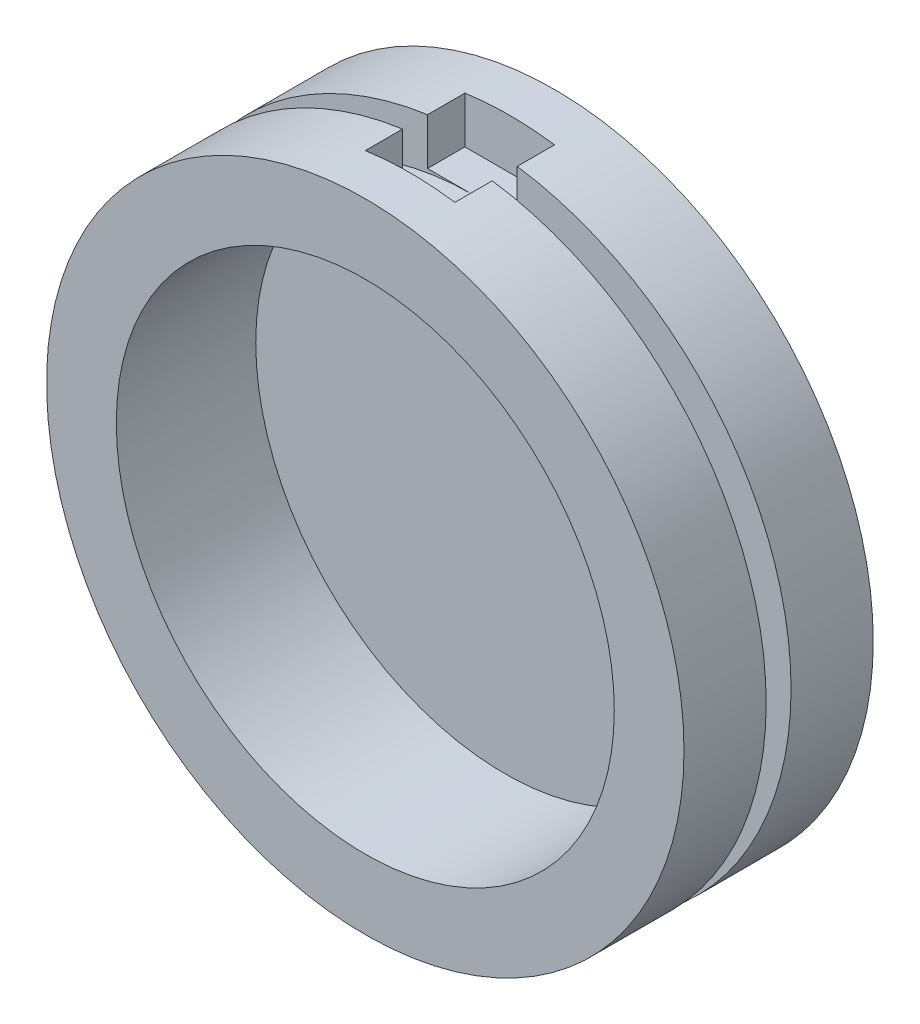
ISO-10303-21;
HEADER;
FILE_DESCRIPTION(('STEP AP214'),'2;1');
FILE_NAME('part.step','',(''),(''),'','','');
FILE_SCHEMA(('AUTOMOTIVE_DESIGN { 1 0 10303 214 1 1 1 1 }'));
ENDSEC;
DATA;
#1=APPLICATION_CONTEXT('core data for automotive mechanical design processes');
#2=APPLICATION_PROTOCOL_DEFINITION('international standard','automotive_design',2000,#1);
#3=PRODUCT_CONTEXT('',#1,'mechanical');
#4=PRODUCT('Part','Part','',(#3));
#5=PRODUCT_RELATED_PRODUCT_CATEGORY('part','',(#4));
#6=PRODUCT_DEFINITION_FORMATION('','',#4);
#7=PRODUCT_DEFINITION_CONTEXT('part definition',#1,'design');
#8=PRODUCT_DEFINITION('design','',#6,#7);
#9=PRODUCT_DEFINITION_SHAPE('','',#8);
#10=(LENGTH_UNIT() NAMED_UNIT(*) SI_UNIT(.MILLI.,.METRE.));
#11=(NAMED_UNIT(*) PLANE_ANGLE_UNIT() SI_UNIT($,.RADIAN.));
#12=(NAMED_UNIT(*) SI_UNIT($,.STERADIAN.) SOLID_ANGLE_UNIT());
#13=UNCERTAINTY_MEASURE_WITH_UNIT(LENGTH_MEASURE(1.E-05),#10,'distance_accuracy_value','');
#14=(GEOMETRIC_REPRESENTATION_CONTEXT(3) GLOBAL_UNCERTAINTY_ASSIGNED_CONTEXT((#13)) GLOBAL_UNIT_ASSIGNED_CONTEXT((#10,
#11,#12)) REPRESENTATION_CONTEXT('',''));
#15=CARTESIAN_POINT('',(0.,0.,0.));
#16=DIRECTION('',(0.,0.,1.));
#17=DIRECTION('',(1.,0.,0.));
#18=AXIS2_PLACEMENT_3D('',#15,#16,#17);
#19=CARTESIAN_POINT('',(0.,0.,5.));
#20=DIRECTION('',(0.,0.,1.));
#21=DIRECTION('',(1.,0.,0.));
#22=AXIS2_PLACEMENT_3D('',#19,#20,#21);
#23=CYLINDRICAL_SURFACE('',#22,32.);
#24=CARTESIAN_POINT('',(0.,0.,0.));
#25=DIRECTION('',(0.,0.,1.));
#26=DIRECTION('',(1.,0.,0.));
#27=AXIS2_PLACEMENT_3D('',#24,#25,#26);
#28=CIRCLE('',#27,32.);
#29=CARTESIAN_POINT('',(32.,0.,0.));
#30=VERTEX_POINT('',#29);
#31=EDGE_CURVE('E283',#30,#30,#28,.T.);
#32=ORIENTED_EDGE('',*,*,#31,.T.);
#33=EDGE_LOOP('',(#32));
#34=FACE_BOUND('',#33,.T.);
#35=DIRECTION('',(0.,0.,1.));
#36=VECTOR('',#35,1.);
#37=CARTESIAN_POINT('',(-4.5,-31.6820138248818,5.));
#38=LINE('',#37,#36);
#39=CARTESIAN_POINT('',(-4.5,-31.6820138248818,8.25));
#40=VERTEX_POINT('',#39);
#41=CARTESIAN_POINT('',(-4.5,-31.6820138248818,4.5));
#42=VERTEX_POINT('',#41);
#43=EDGE_CURVE('E180',#40,#42,#38,.F.);
#44=ORIENTED_EDGE('',*,*,#43,.F.);
#45=CARTESIAN_POINT('',(0.,0.,8.25));
#46=DIRECTION('',(0.,0.,1.));
#47=DIRECTION('',(1.,0.,0.));
#48=AXIS2_PLACEMENT_3D('',#45,#46,#47);
#49=CIRCLE('',#48,32.);
#50=CARTESIAN_POINT('',(-4.5,31.6820138248818,8.25));
#51=VERTEX_POINT('',#50);
#52=EDGE_CURVE('E280',#51,#40,#49,.T.);
#53=ORIENTED_EDGE('',*,*,#52,.F.);
#54=DIRECTION('',(0.,0.,1.));
#55=VECTOR('',#54,1.);
#56=CARTESIAN_POINT('',(-4.5,31.6820138248818,5.));
#57=LINE('',#56,#55);
#58=CARTESIAN_POINT('',(-4.5,31.6820138248818,4.5));
#59=VERTEX_POINT('',#58);
#60=EDGE_CURVE('E251',#51,#59,#57,.F.);
#61=ORIENTED_EDGE('',*,*,#60,.T.);
#62=CARTESIAN_POINT('',(0.,0.,4.5));
#63=DIRECTION('',(0.,0.,-1.));
#64=DIRECTION('',(-1.,0.,0.));
#65=AXIS2_PLACEMENT_3D('',#62,#63,#64);
#66=CIRCLE('',#65,32.);
#67=CARTESIAN_POINT('',(4.5,31.6820138248818,4.5));
#68=VERTEX_POINT('',#67);
#69=EDGE_CURVE('E299',#59,#68,#66,.T.);
#70=ORIENTED_EDGE('',*,*,#69,.T.);
#71=DIRECTION('',(0.,0.,1.));
#72=VECTOR('',#71,1.);
#73=CARTESIAN_POINT('',(4.5,31.6820138248818,5.));
#74=LINE('',#73,#72);
#75=CARTESIAN_POINT('',(4.5,31.6820138248818,8.25));
#76=VERTEX_POINT('',#75);
#77=EDGE_CURVE('E242',#68,#76,#74,.T.);
#78=ORIENTED_EDGE('',*,*,#77,.T.);
#79=CARTESIAN_POINT('',(4.5,-31.6820138248818,8.25));
#80=VERTEX_POINT('',#79);
#81=EDGE_CURVE('E279',#80,#76,#49,.T.);
#82=ORIENTED_EDGE('',*,*,#81,.F.);
#83=DIRECTION('',(0.,0.,1.));
#84=VECTOR('',#83,1.);
#85=CARTESIAN_POINT('',(4.5,-31.6820138248818,5.));
#86=LINE('',#85,#84);
#87=CARTESIAN_POINT('',(4.5,-31.6820138248818,4.5));
#88=VERTEX_POINT('',#87);
#89=EDGE_CURVE('E202',#88,#80,#86,.T.);
#90=ORIENTED_EDGE('',*,*,#89,.F.);
#91=CARTESIAN_POINT('',(0.,0.,4.5));
#92=DIRECTION('',(0.,0.,1.));
#93=DIRECTION('',(1.,0.,0.));
#94=AXIS2_PLACEMENT_3D('',#91,#92,#93);
#95=CIRCLE('',#94,32.);
#96=EDGE_CURVE('E11',#42,#88,#95,.T.);
#97=ORIENTED_EDGE('',*,*,#96,.F.);
#98=EDGE_LOOP('',(#44,#53,#61,#70,#78,#82,#90,#97));
#99=FACE_BOUND('',#98,.T.);
#100=ADVANCED_FACE('F39',(#34,#99),#23,.T.);
#101=CARTESIAN_POINT('',(0.,32.,8.25));
#102=DIRECTION('',(0.,0.,-1.));
#103=DIRECTION('',(-1.,0.,0.));
#104=AXIS2_PLACEMENT_3D('',#101,#102,#103);
#105=PLANE('',#104);
#106=DIRECTION('',(0.,-1.,0.));
#107=VECTOR('',#106,1.);
#108=CARTESIAN_POINT('',(-4.5,32.,8.25));
#109=LINE('',#108,#107);
#110=CARTESIAN_POINT('',(-4.5,-27.,8.25));
#111=VERTEX_POINT('',#110);
#112=EDGE_CURVE('E206',#111,#40,#109,.T.);
#113=ORIENTED_EDGE('',*,*,#112,.F.);
#114=DIRECTION('',(1.,0.,0.));
#115=VECTOR('',#114,1.);
#116=CARTESIAN_POINT('',(0.,-27.,8.25));
#117=LINE('',#116,#115);
#118=CARTESIAN_POINT('',(0.,-27.,8.25));
#119=VERTEX_POINT('',#118);
#120=EDGE_CURVE('E185',#111,#119,#117,.T.);
#121=ORIENTED_EDGE('',*,*,#120,.T.);
#122=CARTESIAN_POINT('',(0.,0.,8.25));
#123=DIRECTION('',(0.,0.,1.));
#124=DIRECTION('',(1.,0.,0.));
#125=AXIS2_PLACEMENT_3D('',#122,#123,#124);
#126=CIRCLE('',#125,27.);
#127=CARTESIAN_POINT('',(0.,27.,8.25));
#128=VERTEX_POINT('',#127);
#129=EDGE_CURVE('E276',#128,#119,#126,.T.);
#130=ORIENTED_EDGE('',*,*,#129,.F.);
#131=DIRECTION('',(-1.,0.,0.));
#132=VECTOR('',#131,1.);
#133=CARTESIAN_POINT('',(0.,27.,8.25));
#134=LINE('',#133,#132);
#135=CARTESIAN_POINT('',(-4.5,27.,8.25));
#136=VERTEX_POINT('',#135);
#137=EDGE_CURVE('E254',#128,#136,#134,.T.);
#138=ORIENTED_EDGE('',*,*,#137,.T.);
#139=DIRECTION('',(0.,1.,0.));
#140=VECTOR('',#139,1.);
#141=CARTESIAN_POINT('',(-4.5,32.,8.25));
#142=LINE('',#141,#140);
#143=EDGE_CURVE('E248',#136,#51,#142,.T.);
#144=ORIENTED_EDGE('',*,*,#143,.T.);
#145=ORIENTED_EDGE('',*,*,#52,.T.);
#146=EDGE_LOOP('',(#113,#121,#130,#138,#144,#145));
#147=FACE_BOUND('',#146,.T.);
#148=ADVANCED_FACE('F337',(#147),#105,.F.);
#149=DIRECTION('',(0.,1.,0.));
#150=VECTOR('',#149,1.);
#151=CARTESIAN_POINT('',(4.5,32.,8.25));
#152=LINE('',#151,#150);
#153=CARTESIAN_POINT('',(4.5,-27.,8.25));
#154=VERTEX_POINT('',#153);
#155=EDGE_CURVE('E200',#80,#154,#152,.T.);
#156=ORIENTED_EDGE('',*,*,#155,.F.);
#157=ORIENTED_EDGE('',*,*,#81,.T.);
#158=DIRECTION('',(0.,-1.,0.));
#159=VECTOR('',#158,1.);
#160=CARTESIAN_POINT('',(4.5,32.,8.25));
#161=LINE('',#160,#159);
#162=CARTESIAN_POINT('',(4.5,27.,8.25));
#163=VERTEX_POINT('',#162);
#164=EDGE_CURVE('E239',#76,#163,#161,.T.);
#165=ORIENTED_EDGE('',*,*,#164,.T.);
#166=EDGE_CURVE('E257',#163,#128,#134,.T.);
#167=ORIENTED_EDGE('',*,*,#166,.T.);
#168=EDGE_CURVE('E275',#119,#128,#126,.T.);
#169=ORIENTED_EDGE('',*,*,#168,.F.);
#170=EDGE_CURVE('E209',#119,#154,#117,.T.);
#171=ORIENTED_EDGE('',*,*,#170,.T.);
#172=EDGE_LOOP('',(#156,#157,#165,#167,#169,#171));
#173=FACE_BOUND('',#172,.T.);
#174=ADVANCED_FACE('F341',(#173),#105,.F.);
#175=CARTESIAN_POINT('',(0.,27.,10.75));
#176=DIRECTION('',(0.,0.,1.));
#177=DIRECTION('',(1.,0.,0.));
#178=AXIS2_PLACEMENT_3D('',#175,#176,#177);
#179=PLANE('',#178);
#180=DIRECTION('',(0.,1.,0.));
#181=VECTOR('',#180,1.);
#182=CARTESIAN_POINT('',(-4.5,27.,10.75));
#183=LINE('',#182,#181);
#184=CARTESIAN_POINT('',(-4.5,-31.6820138248818,10.75));
#185=VERTEX_POINT('',#184);
#186=CARTESIAN_POINT('',(-4.5,-27.,10.75));
#187=VERTEX_POINT('',#186);
#188=EDGE_CURVE('E204',#185,#187,#183,.T.);
#189=ORIENTED_EDGE('',*,*,#188,.F.);
#190=CARTESIAN_POINT('',(0.,0.,10.75));
#191=DIRECTION('',(0.,0.,1.));
#192=DIRECTION('',(1.,0.,0.));
#193=AXIS2_PLACEMENT_3D('',#190,#191,#192);
#194=CIRCLE('',#193,32.);
#195=CARTESIAN_POINT('',(-4.5,31.6820138248818,10.75));
#196=VERTEX_POINT('',#195);
#197=EDGE_CURVE('E268',#196,#185,#194,.T.);
#198=ORIENTED_EDGE('',*,*,#197,.F.);
#199=DIRECTION('',(0.,-1.,0.));
#200=VECTOR('',#199,1.);
#201=CARTESIAN_POINT('',(-4.5,27.,10.75));
#202=LINE('',#201,#200);
#203=CARTESIAN_POINT('',(-4.5,27.,10.75));
#204=VERTEX_POINT('',#203);
#205=EDGE_CURVE('E245',#196,#204,#202,.T.);
#206=ORIENTED_EDGE('',*,*,#205,.T.);
#207=DIRECTION('',(1.,0.,0.));
#208=VECTOR('',#207,1.);
#209=CARTESIAN_POINT('',(0.,27.,10.75));
#210=LINE('',#209,#208);
#211=CARTESIAN_POINT('',(0.,27.,10.75));
#212=VERTEX_POINT('',#211);
#213=EDGE_CURVE('E298',#204,#212,#210,.T.);
#214=ORIENTED_EDGE('',*,*,#213,.T.);
#215=CARTESIAN_POINT('',(0.,0.,10.75));
#216=DIRECTION('',(0.,0.,1.));
#217=DIRECTION('',(1.,0.,0.));
#218=AXIS2_PLACEMENT_3D('',#215,#216,#217);
#219=CIRCLE('',#218,27.);
#220=CARTESIAN_POINT('',(0.,-27.,10.75));
#221=VERTEX_POINT('',#220);
#222=EDGE_CURVE('E272',#212,#221,#219,.T.);
#223=ORIENTED_EDGE('',*,*,#222,.T.);
#224=DIRECTION('',(-1.,0.,0.));
#225=VECTOR('',#224,1.);
#226=CARTESIAN_POINT('',(0.,-27.,10.75));
#227=LINE('',#226,#225);
#228=EDGE_CURVE('E307',#221,#187,#227,.T.);
#229=ORIENTED_EDGE('',*,*,#228,.T.);
#230=EDGE_LOOP('',(#189,#198,#206,#214,#223,#229));
#231=FACE_BOUND('',#230,.T.);
#232=ADVANCED_FACE('F324',(#231),#179,.F.);
#233=DIRECTION('',(0.,-1.,0.));
#234=VECTOR('',#233,1.);
#235=CARTESIAN_POINT('',(4.5,27.,10.75));
#236=LINE('',#235,#234);
#237=CARTESIAN_POINT('',(4.5,-27.,10.75));
#238=VERTEX_POINT('',#237);
#239=CARTESIAN_POINT('',(4.5,-31.6820138248818,10.75));
#240=VERTEX_POINT('',#239);
#241=EDGE_CURVE('E62',#238,#240,#236,.T.);
#242=ORIENTED_EDGE('',*,*,#241,.F.);
#243=EDGE_CURVE('E47',#238,#221,#227,.T.);
#244=ORIENTED_EDGE('',*,*,#243,.T.);
#245=EDGE_CURVE('E271',#221,#212,#219,.T.);
#246=ORIENTED_EDGE('',*,*,#245,.T.);
#247=CARTESIAN_POINT('',(4.5,27.,10.75));
#248=VERTEX_POINT('',#247);
#249=EDGE_CURVE('E295',#212,#248,#210,.T.);
#250=ORIENTED_EDGE('',*,*,#249,.T.);
#251=DIRECTION('',(0.,1.,0.));
#252=VECTOR('',#251,1.);
#253=CARTESIAN_POINT('',(4.5,27.,10.75));
#254=LINE('',#253,#252);
#255=CARTESIAN_POINT('',(4.5,31.6820138248818,10.75));
#256=VERTEX_POINT('',#255);
#257=EDGE_CURVE('E229',#248,#256,#254,.T.);
#258=ORIENTED_EDGE('',*,*,#257,.T.);
#259=EDGE_CURVE('E267',#240,#256,#194,.T.);
#260=ORIENTED_EDGE('',*,*,#259,.F.);
#261=EDGE_LOOP('',(#242,#244,#246,#250,#258,#260));
#262=FACE_BOUND('',#261,.T.);
#263=ADVANCED_FACE('F314',(#262),#179,.F.);
#264=CARTESIAN_POINT('',(0.,0.,5.));
#265=DIRECTION('',(0.,0.,1.));
#266=DIRECTION('',(1.,0.,0.));
#267=AXIS2_PLACEMENT_3D('',#264,#265,#266);
#268=CYLINDRICAL_SURFACE('',#267,32.);
#269=CARTESIAN_POINT('',(0.,0.,19.));
#270=DIRECTION('',(0.,0.,1.));
#271=DIRECTION('',(1.,0.,0.));
#272=AXIS2_PLACEMENT_3D('',#269,#270,#271);
#273=CIRCLE('',#272,32.);
#274=CARTESIAN_POINT('',(32.,0.,19.));
#275=VERTEX_POINT('',#274);
#276=EDGE_CURVE('E264',#275,#275,#273,.T.);
#277=ORIENTED_EDGE('',*,*,#276,.F.);
#278=EDGE_LOOP('',(#277));
#279=FACE_BOUND('',#278,.T.);
#280=CARTESIAN_POINT('',(0.,0.,14.5));
#281=DIRECTION('',(0.,0.,-1.));
#282=DIRECTION('',(-1.,0.,0.));
#283=AXIS2_PLACEMENT_3D('',#280,#281,#282);
#284=CIRCLE('',#283,32.);
#285=CARTESIAN_POINT('',(4.5,-31.6820138248818,14.5));
#286=VERTEX_POINT('',#285);
#287=CARTESIAN_POINT('',(-4.5,-31.6820138248818,14.5));
#288=VERTEX_POINT('',#287);
#289=EDGE_CURVE('E302',#286,#288,#284,.T.);
#290=ORIENTED_EDGE('',*,*,#289,.F.);
#291=DIRECTION('',(0.,0.,1.));
#292=VECTOR('',#291,1.);
#293=CARTESIAN_POINT('',(4.5,-31.6820138248818,5.));
#294=LINE('',#293,#292);
#295=EDGE_CURVE('E306',#240,#286,#294,.T.);
#296=ORIENTED_EDGE('',*,*,#295,.F.);
#297=ORIENTED_EDGE('',*,*,#259,.T.);
#298=DIRECTION('',(0.,0.,1.));
#299=VECTOR('',#298,1.);
#300=CARTESIAN_POINT('',(4.5,31.6820138248818,5.));
#301=LINE('',#300,#299);
#302=CARTESIAN_POINT('',(4.5,31.6820138248818,14.5));
#303=VERTEX_POINT('',#302);
#304=EDGE_CURVE('E292',#256,#303,#301,.T.);
#305=ORIENTED_EDGE('',*,*,#304,.T.);
#306=CARTESIAN_POINT('',(0.,0.,14.5));
#307=DIRECTION('',(0.,0.,1.));
#308=DIRECTION('',(1.,0.,0.));
#309=AXIS2_PLACEMENT_3D('',#306,#307,#308);
#310=CIRCLE('',#309,32.);
#311=CARTESIAN_POINT('',(-4.5,31.6820138248818,14.5));
#312=VERTEX_POINT('',#311);
#313=EDGE_CURVE('E286',#303,#312,#310,.T.);
#314=ORIENTED_EDGE('',*,*,#313,.T.);
#315=DIRECTION('',(0.,0.,1.));
#316=VECTOR('',#315,1.);
#317=CARTESIAN_POINT('',(-4.5,31.6820138248818,5.));
#318=LINE('',#317,#316);
#319=EDGE_CURVE('E289',#312,#196,#318,.F.);
#320=ORIENTED_EDGE('',*,*,#319,.T.);
#321=ORIENTED_EDGE('',*,*,#197,.T.);
#322=DIRECTION('',(0.,0.,1.));
#323=VECTOR('',#322,1.);
#324=CARTESIAN_POINT('',(-4.5,-31.6820138248818,5.));
#325=LINE('',#324,#323);
#326=EDGE_CURVE('E304',#288,#185,#325,.F.);
#327=ORIENTED_EDGE('',*,*,#326,.F.);
#328=EDGE_LOOP('',(#290,#296,#297,#305,#314,#320,#321,#327));
#329=FACE_BOUND('',#328,.T.);
#330=ADVANCED_FACE('F355',(#279,#329),#268,.T.);
#331=CARTESIAN_POINT('',(0.,0.,0.));
#332=DIRECTION('',(0.,0.,1.));
#333=DIRECTION('',(1.,0.,0.));
#334=AXIS2_PLACEMENT_3D('',#331,#332,#333);
#335=PLANE('',#334);
#336=ORIENTED_EDGE('',*,*,#31,.F.);
#337=EDGE_LOOP('',(#336));
#338=FACE_BOUND('',#337,.T.);
#339=ADVANCED_FACE('F41',(#338),#335,.F.);
#340=CARTESIAN_POINT('',(0.,0.,5.));
#341=DIRECTION('',(0.,0.,1.));
#342=DIRECTION('',(1.,0.,0.));
#343=AXIS2_PLACEMENT_3D('',#340,#341,#342);
#344=CYLINDRICAL_SURFACE('',#343,27.);
#345=ORIENTED_EDGE('',*,*,#245,.F.);
#346=ORIENTED_EDGE('',*,*,#222,.F.);
#347=EDGE_LOOP('',(#345,#346));
#348=FACE_BOUND('',#347,.T.);
#349=ORIENTED_EDGE('',*,*,#129,.T.);
#350=ORIENTED_EDGE('',*,*,#168,.T.);
#351=EDGE_LOOP('',(#349,#350));
#352=FACE_BOUND('',#351,.T.);
#353=ADVANCED_FACE('F321',(#348,#352),#344,.T.);
#354=CARTESIAN_POINT('',(0.,32.,19.));
#355=DIRECTION('',(0.,0.,-1.));
#356=DIRECTION('',(-1.,0.,0.));
#357=AXIS2_PLACEMENT_3D('',#354,#355,#356);
#358=PLANE('',#357);
#359=CARTESIAN_POINT('',(0.,0.,19.));
#360=DIRECTION('',(0.,0.,1.));
#361=DIRECTION('',(1.,0.,0.));
#362=AXIS2_PLACEMENT_3D('',#359,#360,#361);
#363=CIRCLE('',#362,25.);
#364=CARTESIAN_POINT('',(25.,0.,19.));
#365=VERTEX_POINT('',#364);
#366=EDGE_CURVE('E261',#365,#365,#363,.T.);
#367=ORIENTED_EDGE('',*,*,#366,.F.);
#368=EDGE_LOOP('',(#367));
#369=FACE_BOUND('',#368,.T.);
#370=ORIENTED_EDGE('',*,*,#276,.T.);
#371=EDGE_LOOP('',(#370));
#372=FACE_BOUND('',#371,.T.);
#373=ADVANCED_FACE('F344',(#369,#372),#358,.F.);
#374=CARTESIAN_POINT('',(0.,0.,5.));
#375=DIRECTION('',(0.,0.,1.));
#376=DIRECTION('',(1.,0.,0.));
#377=AXIS2_PLACEMENT_3D('',#374,#375,#376);
#378=CYLINDRICAL_SURFACE('',#377,25.);
#379=CARTESIAN_POINT('',(0.,0.,5.));
#380=DIRECTION('',(0.,0.,1.));
#381=DIRECTION('',(1.,0.,0.));
#382=AXIS2_PLACEMENT_3D('',#379,#380,#381);
#383=CIRCLE('',#382,25.);
#384=CARTESIAN_POINT('',(25.,0.,5.));
#385=VERTEX_POINT('',#384);
#386=EDGE_CURVE('E258',#385,#385,#383,.T.);
#387=ORIENTED_EDGE('',*,*,#386,.F.);
#388=EDGE_LOOP('',(#387));
#389=FACE_BOUND('',#388,.T.);
#390=ORIENTED_EDGE('',*,*,#366,.T.);
#391=EDGE_LOOP('',(#390));
#392=FACE_BOUND('',#391,.T.);
#393=ADVANCED_FACE('F351',(#389,#392),#378,.F.);
#394=CARTESIAN_POINT('',(0.,25.,5.));
#395=DIRECTION('',(0.,0.,-1.));
#396=DIRECTION('',(-1.,0.,0.));
#397=AXIS2_PLACEMENT_3D('',#394,#395,#396);
#398=PLANE('',#397);
#399=ORIENTED_EDGE('',*,*,#386,.T.);
#400=EDGE_LOOP('',(#399));
#401=FACE_BOUND('',#400,.T.);
#402=ADVANCED_FACE('F415',(#401),#398,.F.);
#403=CARTESIAN_POINT('',(-4.5,27.,14.5));
#404=DIRECTION('',(0.,0.,1.));
#405=DIRECTION('',(1.,0.,0.));
#406=AXIS2_PLACEMENT_3D('',#403,#404,#405);
#407=PLANE('',#406);
#408=DIRECTION('',(0.,1.,0.));
#409=VECTOR('',#408,1.);
#410=CARTESIAN_POINT('',(4.5,27.,14.5));
#411=LINE('',#410,#409);
#412=CARTESIAN_POINT('',(4.5,27.,14.5));
#413=VERTEX_POINT('',#412);
#414=EDGE_CURVE('E233',#413,#303,#411,.T.);
#415=ORIENTED_EDGE('',*,*,#414,.F.);
#416=DIRECTION('',(1.,0.,0.));
#417=VECTOR('',#416,1.);
#418=CARTESIAN_POINT('',(-4.5,27.,14.5));
#419=LINE('',#418,#417);
#420=CARTESIAN_POINT('',(-4.5,27.,14.5));
#421=VERTEX_POINT('',#420);
#422=EDGE_CURVE('E214',#421,#413,#419,.T.);
#423=ORIENTED_EDGE('',*,*,#422,.F.);
#424=DIRECTION('',(0.,1.,0.));
#425=VECTOR('',#424,1.);
#426=CARTESIAN_POINT('',(-4.5,27.,14.5));
#427=LINE('',#426,#425);
#428=EDGE_CURVE('E225',#421,#312,#427,.T.);
#429=ORIENTED_EDGE('',*,*,#428,.T.);
#430=ORIENTED_EDGE('',*,*,#313,.F.);
#431=EDGE_LOOP('',(#415,#423,#429,#430));
#432=FACE_BOUND('',#431,.T.);
#433=ADVANCED_FACE('F409',(#432),#407,.F.);
#434=CARTESIAN_POINT('',(4.5,27.,14.5));
#435=DIRECTION('',(1.,0.,0.));
#436=DIRECTION('',(0.,0.,-1.));
#437=AXIS2_PLACEMENT_3D('',#434,#435,#436);
#438=PLANE('',#437);
#439=DIRECTION('',(0.,0.,-1.));
#440=VECTOR('',#439,1.);
#441=CARTESIAN_POINT('',(4.5,27.,14.5));
#442=LINE('',#441,#440);
#443=EDGE_CURVE('E219',#413,#248,#442,.T.);
#444=ORIENTED_EDGE('',*,*,#443,.F.);
#445=ORIENTED_EDGE('',*,*,#414,.T.);
#446=ORIENTED_EDGE('',*,*,#304,.F.);
#447=ORIENTED_EDGE('',*,*,#257,.F.);
#448=EDGE_LOOP('',(#444,#445,#446,#447));
#449=FACE_BOUND('',#448,.T.);
#450=ADVANCED_FACE('F400',(#449),#438,.F.);
#451=CARTESIAN_POINT('',(-4.5,27.,14.5));
#452=DIRECTION('',(-1.,0.,0.));
#453=DIRECTION('',(0.,0.,1.));
#454=AXIS2_PLACEMENT_3D('',#451,#452,#453);
#455=PLANE('',#454);
#456=ORIENTED_EDGE('',*,*,#319,.F.);
#457=ORIENTED_EDGE('',*,*,#428,.F.);
#458=DIRECTION('',(0.,0.,1.));
#459=VECTOR('',#458,1.);
#460=CARTESIAN_POINT('',(-4.5,27.,14.5));
#461=LINE('',#460,#459);
#462=EDGE_CURVE('E215',#204,#421,#461,.T.);
#463=ORIENTED_EDGE('',*,*,#462,.F.);
#464=ORIENTED_EDGE('',*,*,#205,.F.);
#465=EDGE_LOOP('',(#456,#457,#463,#464));
#466=FACE_BOUND('',#465,.T.);
#467=ADVANCED_FACE('F332',(#466),#455,.F.);
#468=CARTESIAN_POINT('',(0.,27.,0.));
#469=DIRECTION('',(0.,-1.,0.));
#470=DIRECTION('',(0.,0.,-1.));
#471=AXIS2_PLACEMENT_3D('',#468,#469,#470);
#472=PLANE('',#471);
#473=ORIENTED_EDGE('',*,*,#462,.T.);
#474=ORIENTED_EDGE('',*,*,#422,.T.);
#475=ORIENTED_EDGE('',*,*,#443,.T.);
#476=ORIENTED_EDGE('',*,*,#249,.F.);
#477=ORIENTED_EDGE('',*,*,#213,.F.);
#478=EDGE_LOOP('',(#473,#474,#475,#476,#477));
#479=FACE_BOUND('',#478,.T.);
#480=ADVANCED_FACE('F328',(#479),#472,.F.);
#481=CARTESIAN_POINT('',(-4.5,27.,4.5));
#482=DIRECTION('',(0.,0.,-1.));
#483=DIRECTION('',(-1.,0.,0.));
#484=AXIS2_PLACEMENT_3D('',#481,#482,#483);
#485=PLANE('',#484);
#486=DIRECTION('',(0.,1.,0.));
#487=VECTOR('',#486,1.);
#488=CARTESIAN_POINT('',(-4.5,27.,4.5));
#489=LINE('',#488,#487);
#490=CARTESIAN_POINT('',(-4.5,27.,4.5));
#491=VERTEX_POINT('',#490);
#492=EDGE_CURVE('E226',#491,#59,#489,.T.);
#493=ORIENTED_EDGE('',*,*,#492,.F.);
#494=DIRECTION('',(-1.,0.,0.));
#495=VECTOR('',#494,1.);
#496=CARTESIAN_POINT('',(-4.5,27.,4.5));
#497=LINE('',#496,#495);
#498=CARTESIAN_POINT('',(4.5,27.,4.5));
#499=VERTEX_POINT('',#498);
#500=EDGE_CURVE('E222',#499,#491,#497,.T.);
#501=ORIENTED_EDGE('',*,*,#500,.F.);
#502=DIRECTION('',(0.,1.,0.));
#503=VECTOR('',#502,1.);
#504=CARTESIAN_POINT('',(4.5,27.,4.5));
#505=LINE('',#504,#503);
#506=EDGE_CURVE('E230',#499,#68,#505,.T.);
#507=ORIENTED_EDGE('',*,*,#506,.T.);
#508=ORIENTED_EDGE('',*,*,#69,.F.);
#509=EDGE_LOOP('',(#493,#501,#507,#508));
#510=FACE_BOUND('',#509,.T.);
#511=ADVANCED_FACE('F375',(#510),#485,.F.);
#512=EDGE_CURVE('E218',#163,#499,#442,.T.);
#513=ORIENTED_EDGE('',*,*,#512,.T.);
#514=ORIENTED_EDGE('',*,*,#500,.T.);
#515=EDGE_CURVE('E212',#491,#136,#461,.T.);
#516=ORIENTED_EDGE('',*,*,#515,.T.);
#517=ORIENTED_EDGE('',*,*,#137,.F.);
#518=ORIENTED_EDGE('',*,*,#166,.F.);
#519=EDGE_LOOP('',(#513,#514,#516,#517,#518));
#520=FACE_BOUND('',#519,.T.);
#521=ADVANCED_FACE('F404',(#520),#472,.F.);
#522=ORIENTED_EDGE('',*,*,#143,.F.);
#523=ORIENTED_EDGE('',*,*,#515,.F.);
#524=ORIENTED_EDGE('',*,*,#492,.T.);
#525=ORIENTED_EDGE('',*,*,#60,.F.);
#526=EDGE_LOOP('',(#522,#523,#524,#525));
#527=FACE_BOUND('',#526,.T.);
#528=ADVANCED_FACE('F372',(#527),#455,.F.);
#529=ORIENTED_EDGE('',*,*,#506,.F.);
#530=ORIENTED_EDGE('',*,*,#512,.F.);
#531=ORIENTED_EDGE('',*,*,#164,.F.);
#532=ORIENTED_EDGE('',*,*,#77,.F.);
#533=EDGE_LOOP('',(#529,#530,#531,#532));
#534=FACE_BOUND('',#533,.T.);
#535=ADVANCED_FACE('F380',(#534),#438,.F.);
#536=CARTESIAN_POINT('',(4.5,-27.,14.5));
#537=DIRECTION('',(-1.,0.,0.));
#538=DIRECTION('',(0.,0.,1.));
#539=AXIS2_PLACEMENT_3D('',#536,#537,#538);
#540=PLANE('',#539);
#541=ORIENTED_EDGE('',*,*,#241,.T.);
#542=ORIENTED_EDGE('',*,*,#295,.T.);
#543=DIRECTION('',(0.,-1.,0.));
#544=VECTOR('',#543,1.);
#545=CARTESIAN_POINT('',(4.5,-27.,14.5));
#546=LINE('',#545,#544);
#547=CARTESIAN_POINT('',(4.5,-27.,14.5));
#548=VERTEX_POINT('',#547);
#549=EDGE_CURVE('E195',#548,#286,#546,.T.);
#550=ORIENTED_EDGE('',*,*,#549,.F.);
#551=DIRECTION('',(0.,0.,-1.));
#552=VECTOR('',#551,1.);
#553=CARTESIAN_POINT('',(4.5,-27.,14.5));
#554=LINE('',#553,#552);
#555=EDGE_CURVE('E189',#548,#238,#554,.T.);
#556=ORIENTED_EDGE('',*,*,#555,.T.);
#557=EDGE_LOOP('',(#541,#542,#550,#556));
#558=FACE_BOUND('',#557,.T.);
#559=ADVANCED_FACE('F386',(#558),#540,.T.);
#560=CARTESIAN_POINT('',(-4.5,-27.,14.5));
#561=DIRECTION('',(0.,0.,-1.));
#562=DIRECTION('',(-1.,0.,0.));
#563=AXIS2_PLACEMENT_3D('',#560,#561,#562);
#564=PLANE('',#563);
#565=ORIENTED_EDGE('',*,*,#549,.T.);
#566=ORIENTED_EDGE('',*,*,#289,.T.);
#567=DIRECTION('',(0.,-1.,0.));
#568=VECTOR('',#567,1.);
#569=CARTESIAN_POINT('',(-4.5,-27.,14.5));
#570=LINE('',#569,#568);
#571=CARTESIAN_POINT('',(-4.5,-27.,14.5));
#572=VERTEX_POINT('',#571);
#573=EDGE_CURVE('E192',#572,#288,#570,.T.);
#574=ORIENTED_EDGE('',*,*,#573,.F.);
#575=DIRECTION('',(1.,0.,0.));
#576=VECTOR('',#575,1.);
#577=CARTESIAN_POINT('',(-4.5,-27.,14.5));
#578=LINE('',#577,#576);
#579=EDGE_CURVE('E181',#572,#548,#578,.T.);
#580=ORIENTED_EDGE('',*,*,#579,.T.);
#581=EDGE_LOOP('',(#565,#566,#574,#580));
#582=FACE_BOUND('',#581,.T.);
#583=ADVANCED_FACE('F394',(#582),#564,.T.);
#584=CARTESIAN_POINT('',(-4.5,-27.,14.5));
#585=DIRECTION('',(1.,0.,0.));
#586=DIRECTION('',(0.,0.,-1.));
#587=AXIS2_PLACEMENT_3D('',#584,#585,#586);
#588=PLANE('',#587);
#589=ORIENTED_EDGE('',*,*,#188,.T.);
#590=DIRECTION('',(0.,0.,1.));
#591=VECTOR('',#590,1.);
#592=CARTESIAN_POINT('',(-4.5,-27.,14.5));
#593=LINE('',#592,#591);
#594=EDGE_CURVE('E186',#187,#572,#593,.T.);
#595=ORIENTED_EDGE('',*,*,#594,.T.);
#596=ORIENTED_EDGE('',*,*,#573,.T.);
#597=ORIENTED_EDGE('',*,*,#326,.T.);
#598=EDGE_LOOP('',(#589,#595,#596,#597));
#599=FACE_BOUND('',#598,.T.);
#600=ADVANCED_FACE('F391',(#599),#588,.T.);
#601=CARTESIAN_POINT('',(0.,-27.,0.));
#602=DIRECTION('',(0.,1.,0.));
#603=DIRECTION('',(0.,0.,-1.));
#604=AXIS2_PLACEMENT_3D('',#601,#602,#603);
#605=PLANE('',#604);
#606=ORIENTED_EDGE('',*,*,#555,.F.);
#607=ORIENTED_EDGE('',*,*,#579,.F.);
#608=ORIENTED_EDGE('',*,*,#594,.F.);
#609=ORIENTED_EDGE('',*,*,#228,.F.);
#610=ORIENTED_EDGE('',*,*,#243,.F.);
#611=EDGE_LOOP('',(#606,#607,#608,#609,#610));
#612=FACE_BOUND('',#611,.T.);
#613=ADVANCED_FACE('F425',(#612),#605,.F.);
#614=CARTESIAN_POINT('',(-4.5,-27.,4.5));
#615=DIRECTION('',(0.,0.,1.));
#616=DIRECTION('',(1.,0.,0.));
#617=AXIS2_PLACEMENT_3D('',#614,#615,#616);
#618=PLANE('',#617);
#619=DIRECTION('',(0.,-1.,0.));
#620=VECTOR('',#619,1.);
#621=CARTESIAN_POINT('',(-4.5,-27.,4.5));
#622=LINE('',#621,#620);
#623=CARTESIAN_POINT('',(-4.5,-27.,4.5));
#624=VERTEX_POINT('',#623);
#625=EDGE_CURVE('E168',#624,#42,#622,.T.);
#626=ORIENTED_EDGE('',*,*,#625,.T.);
#627=ORIENTED_EDGE('',*,*,#96,.T.);
#628=DIRECTION('',(0.,-1.,0.));
#629=VECTOR('',#628,1.);
#630=CARTESIAN_POINT('',(4.5,-27.,4.5));
#631=LINE('',#630,#629);
#632=CARTESIAN_POINT('',(4.5,-27.,4.5));
#633=VERTEX_POINT('',#632);
#634=EDGE_CURVE('E170',#633,#88,#631,.T.);
#635=ORIENTED_EDGE('',*,*,#634,.F.);
#636=DIRECTION('',(-1.,0.,0.));
#637=VECTOR('',#636,1.);
#638=CARTESIAN_POINT('',(-4.5,-27.,4.5));
#639=LINE('',#638,#637);
#640=EDGE_CURVE('E165',#633,#624,#639,.T.);
#641=ORIENTED_EDGE('',*,*,#640,.T.);
#642=EDGE_LOOP('',(#626,#627,#635,#641));
#643=FACE_BOUND('',#642,.T.);
#644=ADVANCED_FACE('F167',(#643),#618,.T.);
#645=EDGE_CURVE('E172',#624,#111,#593,.T.);
#646=ORIENTED_EDGE('',*,*,#645,.F.);
#647=ORIENTED_EDGE('',*,*,#640,.F.);
#648=EDGE_CURVE('E54',#154,#633,#554,.T.);
#649=ORIENTED_EDGE('',*,*,#648,.F.);
#650=ORIENTED_EDGE('',*,*,#170,.F.);
#651=ORIENTED_EDGE('',*,*,#120,.F.);
#652=EDGE_LOOP('',(#646,#647,#649,#650,#651));
#653=FACE_BOUND('',#652,.T.);
#654=ADVANCED_FACE('F183',(#653),#605,.F.);
#655=ORIENTED_EDGE('',*,*,#43,.T.);
#656=ORIENTED_EDGE('',*,*,#625,.F.);
#657=ORIENTED_EDGE('',*,*,#645,.T.);
#658=ORIENTED_EDGE('',*,*,#112,.T.);
#659=EDGE_LOOP('',(#655,#656,#657,#658));
#660=FACE_BOUND('',#659,.T.);
#661=ADVANCED_FACE('F177',(#660),#588,.T.);
#662=ORIENTED_EDGE('',*,*,#89,.T.);
#663=ORIENTED_EDGE('',*,*,#155,.T.);
#664=ORIENTED_EDGE('',*,*,#648,.T.);
#665=ORIENTED_EDGE('',*,*,#634,.T.);
#666=EDGE_LOOP('',(#662,#663,#664,#665));
#667=FACE_BOUND('',#666,.T.);
#668=ADVANCED_FACE('F383',(#667),#540,.T.);
#669=CLOSED_SHELL('',(#100,#148,#174,#232,#263,#330,#339,#353,#373,#393,#402,#433,#450,#467,
#480,#511,#521,#528,#535,#559,#583,#600,#613,#644,#654,#661,#668));
#670=MANIFOLD_SOLID_BREP('B2',#669);
#671=ADVANCED_BREP_SHAPE_REPRESENTATION('',(#18,#670),#14);
#672=SHAPE_DEFINITION_REPRESENTATION(#9,#671);
ENDSEC;
END-ISO-10303-21;
